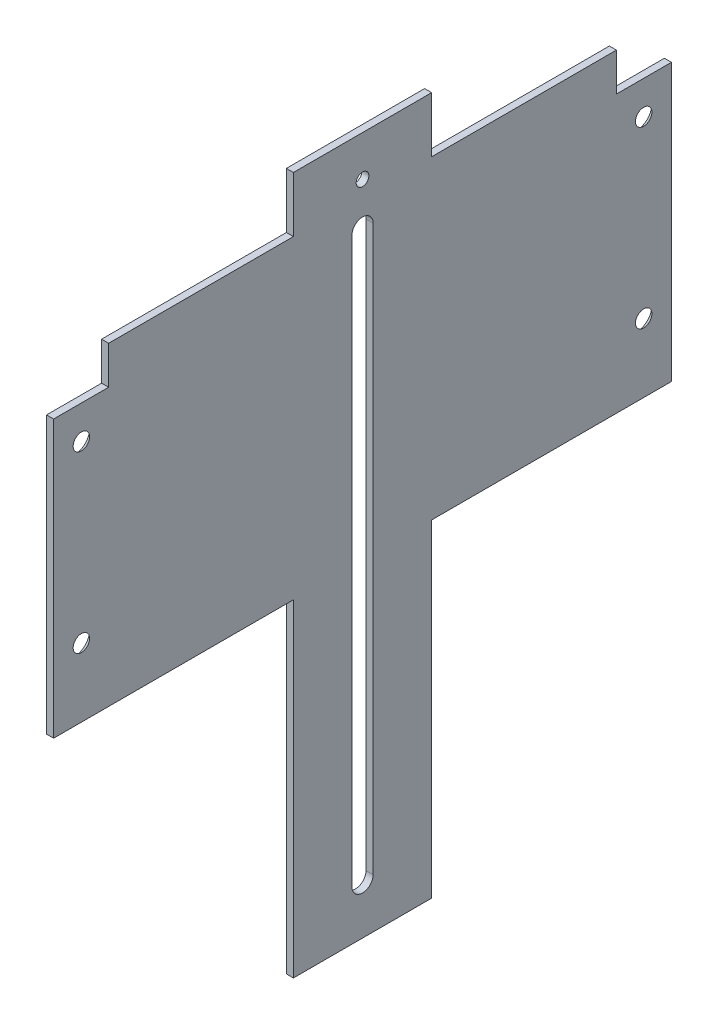
ISO-10303-21;
HEADER;
FILE_DESCRIPTION(('STEP AP214'),'2;1');
FILE_NAME('part.step','',(''),(''),'','','');
FILE_SCHEMA(('AUTOMOTIVE_DESIGN { 1 0 10303 214 1 1 1 1 }'));
ENDSEC;
DATA;
#1=APPLICATION_CONTEXT('core data for automotive mechanical design processes');
#2=APPLICATION_PROTOCOL_DEFINITION('international standard','automotive_design',2000,#1);
#3=PRODUCT_CONTEXT('',#1,'mechanical');
#4=PRODUCT('Part','Part','',(#3));
#5=PRODUCT_RELATED_PRODUCT_CATEGORY('part','',(#4));
#6=PRODUCT_DEFINITION_FORMATION('','',#4);
#7=PRODUCT_DEFINITION_CONTEXT('part definition',#1,'design');
#8=PRODUCT_DEFINITION('design','',#6,#7);
#9=PRODUCT_DEFINITION_SHAPE('','',#8);
#10=(LENGTH_UNIT() NAMED_UNIT(*) SI_UNIT(.MILLI.,.METRE.));
#11=(NAMED_UNIT(*) PLANE_ANGLE_UNIT() SI_UNIT($,.RADIAN.));
#12=(NAMED_UNIT(*) SI_UNIT($,.STERADIAN.) SOLID_ANGLE_UNIT());
#13=UNCERTAINTY_MEASURE_WITH_UNIT(LENGTH_MEASURE(1.E-05),#10,'distance_accuracy_value','');
#14=(GEOMETRIC_REPRESENTATION_CONTEXT(3) GLOBAL_UNCERTAINTY_ASSIGNED_CONTEXT((#13)) GLOBAL_UNIT_ASSIGNED_CONTEXT((#10,
#11,#12)) REPRESENTATION_CONTEXT('',''));
#15=CARTESIAN_POINT('',(0.,0.,0.));
#16=DIRECTION('',(0.,0.,1.));
#17=DIRECTION('',(1.,0.,0.));
#18=AXIS2_PLACEMENT_3D('',#15,#16,#17);
#19=CARTESIAN_POINT('',(0.,0.,0.));
#20=DIRECTION('',(1.,0.,0.));
#21=DIRECTION('',(0.,0.,-1.));
#22=AXIS2_PLACEMENT_3D('',#19,#20,#21);
#23=PLANE('',#22);
#24=CARTESIAN_POINT('',(0.,-52.5909473684211,-31.3460500310203));
#25=DIRECTION('',(-1.,0.,0.));
#26=DIRECTION('',(0.,0.,1.));
#27=AXIS2_PLACEMENT_3D('',#24,#25,#26);
#28=CIRCLE('',#27,2.75);
#29=CARTESIAN_POINT('',(0.,-52.5909473684211,-28.5960500310203));
#30=VERTEX_POINT('',#29);
#31=EDGE_CURVE('E386',#30,#30,#28,.T.);
#32=ORIENTED_EDGE('',*,*,#31,.F.);
#33=EDGE_LOOP('',(#32));
#34=FACE_BOUND('',#33,.T.);
#35=CARTESIAN_POINT('',(0.,-21.1486455373109,69.9059499689797));
#36=DIRECTION('',(-1.,0.,0.));
#37=DIRECTION('',(0.,0.,1.));
#38=AXIS2_PLACEMENT_3D('',#35,#36,#37);
#39=CIRCLE('',#38,2.75);
#40=CARTESIAN_POINT('',(0.,-21.1486455373109,72.6559499689797));
#41=VERTEX_POINT('',#40);
#42=EDGE_CURVE('E380',#41,#41,#39,.T.);
#43=ORIENTED_EDGE('',*,*,#42,.F.);
#44=EDGE_LOOP('',(#43));
#45=FACE_BOUND('',#44,.T.);
#46=CARTESIAN_POINT('',(0.,-5.59189553731093,19.2799499689797));
#47=DIRECTION('',(-1.,0.,0.));
#48=DIRECTION('',(0.,0.,1.));
#49=AXIS2_PLACEMENT_3D('',#46,#47,#48);
#50=CIRCLE('',#49,1.143);
#51=CARTESIAN_POINT('',(0.,-5.59189553731093,20.4229499689797));
#52=VERTEX_POINT('',#51);
#53=EDGE_CURVE('E368',#52,#52,#50,.T.);
#54=ORIENTED_EDGE('',*,*,#53,.F.);
#55=EDGE_LOOP('',(#54));
#56=FACE_BOUND('',#55,.T.);
#57=DIRECTION('',(0.,-1.,0.));
#58=VECTOR('',#57,1.);
#59=CARTESIAN_POINT('',(0.,-13.3706455373109,17.3749499689797));
#60=LINE('',#59,#58);
#61=CARTESIAN_POINT('',(0.,-13.3706455373109,17.3749499689797));
#62=VERTEX_POINT('',#61);
#63=CARTESIAN_POINT('',(0.,-114.970645537311,17.3749499689797));
#64=VERTEX_POINT('',#63);
#65=EDGE_CURVE('E159',#62,#64,#60,.T.);
#66=ORIENTED_EDGE('',*,*,#65,.F.);
#67=CARTESIAN_POINT('',(0.,-13.3706455373109,19.2799499689797));
#68=DIRECTION('',(-1.,0.,0.));
#69=DIRECTION('',(0.,0.,1.));
#70=AXIS2_PLACEMENT_3D('',#67,#68,#69);
#71=CIRCLE('',#70,1.905);
#72=CARTESIAN_POINT('',(0.,-13.3706455373109,21.1849499689797));
#73=VERTEX_POINT('',#72);
#74=EDGE_CURVE('E364',#73,#62,#71,.T.);
#75=ORIENTED_EDGE('',*,*,#74,.F.);
#76=DIRECTION('',(0.,1.,0.));
#77=VECTOR('',#76,1.);
#78=CARTESIAN_POINT('',(0.,-13.3706455373109,21.1849499689797));
#79=LINE('',#78,#77);
#80=CARTESIAN_POINT('',(0.,-114.970645537311,21.1849499689797));
#81=VERTEX_POINT('',#80);
#82=EDGE_CURVE('E359',#81,#73,#79,.T.);
#83=ORIENTED_EDGE('',*,*,#82,.F.);
#84=CARTESIAN_POINT('',(0.,-114.970645537311,19.2799499689797));
#85=DIRECTION('',(-1.,0.,0.));
#86=DIRECTION('',(0.,0.,1.));
#87=AXIS2_PLACEMENT_3D('',#84,#85,#86);
#88=CIRCLE('',#87,1.90499999999999);
#89=EDGE_CURVE('E319',#64,#81,#88,.T.);
#90=ORIENTED_EDGE('',*,*,#89,.F.);
#91=EDGE_LOOP('',(#66,#75,#83,#90));
#92=FACE_BOUND('',#91,.T.);
#93=DIRECTION('',(0.,0.,1.));
#94=VECTOR('',#93,1.);
#95=CARTESIAN_POINT('',(0.,-8.29064553731093,-36.3460500310203));
#96=LINE('',#95,#94);
#97=CARTESIAN_POINT('',(0.,-8.29064553731093,-26.4400500310203));
#98=VERTEX_POINT('',#97);
#99=CARTESIAN_POINT('',(0.,-8.29064553731093,6.83394996897969));
#100=VERTEX_POINT('',#99);
#101=EDGE_CURVE('E357',#98,#100,#96,.T.);
#102=ORIENTED_EDGE('',*,*,#101,.F.);
#103=DIRECTION('',(0.,1.,0.));
#104=VECTOR('',#103,1.);
#105=CARTESIAN_POINT('',(0.,-8.29064553731093,-26.4400500310203));
#106=LINE('',#105,#104);
#107=CARTESIAN_POINT('',(0.,-15.1486455373109,-26.4400500310203));
#108=VERTEX_POINT('',#107);
#109=EDGE_CURVE('E134',#108,#98,#106,.T.);
#110=ORIENTED_EDGE('',*,*,#109,.F.);
#111=DIRECTION('',(0.,0.,1.));
#112=VECTOR('',#111,1.);
#113=CARTESIAN_POINT('',(0.,-15.1486455373109,-36.3460500310203));
#114=LINE('',#113,#112);
#115=CARTESIAN_POINT('',(0.,-15.1486455373109,-36.3460500310203));
#116=VERTEX_POINT('',#115);
#117=EDGE_CURVE('E249',#116,#108,#114,.T.);
#118=ORIENTED_EDGE('',*,*,#117,.F.);
#119=DIRECTION('',(0.,1.,0.));
#120=VECTOR('',#119,1.);
#121=CARTESIAN_POINT('',(0.,-8.29064553731093,-36.3460500310203));
#122=LINE('',#121,#120);
#123=CARTESIAN_POINT('',(0.,-64.9326455373109,-36.3460500310203));
#124=VERTEX_POINT('',#123);
#125=EDGE_CURVE('E259',#124,#116,#122,.T.);
#126=ORIENTED_EDGE('',*,*,#125,.F.);
#127=DIRECTION('',(0.,0.,-1.));
#128=VECTOR('',#127,1.);
#129=CARTESIAN_POINT('',(0.,-64.9326455373109,-36.3460500310203));
#130=LINE('',#129,#128);
#131=CARTESIAN_POINT('',(0.,-64.9326455373109,6.83394996897969));
#132=VERTEX_POINT('',#131);
#133=EDGE_CURVE('E263',#132,#124,#130,.T.);
#134=ORIENTED_EDGE('',*,*,#133,.F.);
#135=DIRECTION('',(0.,1.,0.));
#136=VECTOR('',#135,1.);
#137=CARTESIAN_POINT('',(0.,-64.9326455373109,6.83394996897969));
#138=LINE('',#137,#136);
#139=CARTESIAN_POINT('',(0.,-123.911447322897,6.83394996897969));
#140=VERTEX_POINT('',#139);
#141=EDGE_CURVE('E265',#140,#132,#138,.T.);
#142=ORIENTED_EDGE('',*,*,#141,.F.);
#143=DIRECTION('',(0.,0.,-1.));
#144=VECTOR('',#143,1.);
#145=CARTESIAN_POINT('',(0.,-123.911447322897,6.83394996897969));
#146=LINE('',#145,#144);
#147=CARTESIAN_POINT('',(0.,-123.911447322897,31.7259499689797));
#148=VERTEX_POINT('',#147);
#149=EDGE_CURVE('E271',#148,#140,#146,.T.);
#150=ORIENTED_EDGE('',*,*,#149,.F.);
#151=DIRECTION('',(0.,-1.,0.));
#152=VECTOR('',#151,1.);
#153=CARTESIAN_POINT('',(0.,-123.911447322897,31.7259499689797));
#154=LINE('',#153,#152);
#155=CARTESIAN_POINT('',(0.,-64.9326455373109,31.7259499689797));
#156=VERTEX_POINT('',#155);
#157=EDGE_CURVE('E274',#156,#148,#154,.T.);
#158=ORIENTED_EDGE('',*,*,#157,.F.);
#159=DIRECTION('',(0.,0.,-1.));
#160=VECTOR('',#159,1.);
#161=CARTESIAN_POINT('',(0.,-64.9326455373109,31.7259499689797));
#162=LINE('',#161,#160);
#163=CARTESIAN_POINT('',(0.,-64.9326455373109,74.9059499689797));
#164=VERTEX_POINT('',#163);
#165=EDGE_CURVE('E277',#164,#156,#162,.T.);
#166=ORIENTED_EDGE('',*,*,#165,.F.);
#167=DIRECTION('',(0.,-1.,0.));
#168=VECTOR('',#167,1.);
#169=CARTESIAN_POINT('',(0.,-8.29064553731093,74.9059499689797));
#170=LINE('',#169,#168);
#171=CARTESIAN_POINT('',(0.,-15.1486455373109,74.9059499689797));
#172=VERTEX_POINT('',#171);
#173=EDGE_CURVE('E280',#172,#164,#170,.T.);
#174=ORIENTED_EDGE('',*,*,#173,.F.);
#175=DIRECTION('',(0.,0.,1.));
#176=VECTOR('',#175,1.);
#177=CARTESIAN_POINT('',(0.,-15.1486455373109,74.9059499689797));
#178=LINE('',#177,#176);
#179=CARTESIAN_POINT('',(0.,-15.1486455373109,64.9999499689797));
#180=VERTEX_POINT('',#179);
#181=EDGE_CURVE('E283',#180,#172,#178,.T.);
#182=ORIENTED_EDGE('',*,*,#181,.F.);
#183=DIRECTION('',(0.,-1.,0.));
#184=VECTOR('',#183,1.);
#185=CARTESIAN_POINT('',(0.,-8.29064553731092,64.9999499689797));
#186=LINE('',#185,#184);
#187=CARTESIAN_POINT('',(0.,-8.29064553731093,64.9999499689797));
#188=VERTEX_POINT('',#187);
#189=EDGE_CURVE('E286',#188,#180,#186,.T.);
#190=ORIENTED_EDGE('',*,*,#189,.F.);
#191=DIRECTION('',(0.,0.,1.));
#192=VECTOR('',#191,1.);
#193=CARTESIAN_POINT('',(0.,-8.29064553731092,31.7259499689797));
#194=LINE('',#193,#192);
#195=CARTESIAN_POINT('',(0.,-8.29064553731092,31.7259499689797));
#196=VERTEX_POINT('',#195);
#197=EDGE_CURVE('E289',#196,#188,#194,.T.);
#198=ORIENTED_EDGE('',*,*,#197,.F.);
#199=DIRECTION('',(0.,-1.,0.));
#200=VECTOR('',#199,1.);
#201=CARTESIAN_POINT('',(0.,1.70935446268907,31.7259499689797));
#202=LINE('',#201,#200);
#203=CARTESIAN_POINT('',(0.,1.70935446268907,31.7259499689797));
#204=VERTEX_POINT('',#203);
#205=EDGE_CURVE('E292',#204,#196,#202,.T.);
#206=ORIENTED_EDGE('',*,*,#205,.F.);
#207=DIRECTION('',(0.,0.,1.));
#208=VECTOR('',#207,1.);
#209=CARTESIAN_POINT('',(0.,1.70935446268908,6.83394996897969));
#210=LINE('',#209,#208);
#211=CARTESIAN_POINT('',(0.,1.70935446268908,6.83394996897969));
#212=VERTEX_POINT('',#211);
#213=EDGE_CURVE('E295',#212,#204,#210,.T.);
#214=ORIENTED_EDGE('',*,*,#213,.F.);
#215=DIRECTION('',(0.,1.,0.));
#216=VECTOR('',#215,1.);
#217=CARTESIAN_POINT('',(0.,-8.29064553731093,6.83394996897969));
#218=LINE('',#217,#216);
#219=EDGE_CURVE('E207',#100,#212,#218,.T.);
#220=ORIENTED_EDGE('',*,*,#219,.F.);
#221=EDGE_LOOP('',(#102,#110,#118,#126,#134,#142,#150,#158,#166,#174,#182,#190,#198,#206,#214,#220));
#222=FACE_BOUND('',#221,.T.);
#223=CARTESIAN_POINT('',(0.,-52.5909473684211,69.9059499689797));
#224=DIRECTION('',(-1.,0.,0.));
#225=DIRECTION('',(0.,0.,1.));
#226=AXIS2_PLACEMENT_3D('',#223,#224,#225);
#227=CIRCLE('',#226,2.75);
#228=CARTESIAN_POINT('',(0.,-52.5909473684211,72.6559499689797));
#229=VERTEX_POINT('',#228);
#230=EDGE_CURVE('E374',#229,#229,#227,.T.);
#231=ORIENTED_EDGE('',*,*,#230,.F.);
#232=EDGE_LOOP('',(#231));
#233=FACE_BOUND('',#232,.T.);
#234=CARTESIAN_POINT('',(0.,-21.1486455373109,-31.3460500310203));
#235=DIRECTION('',(-1.,0.,0.));
#236=DIRECTION('',(0.,0.,1.));
#237=AXIS2_PLACEMENT_3D('',#234,#235,#236);
#238=CIRCLE('',#237,2.75);
#239=CARTESIAN_POINT('',(0.,-21.1486455373109,-28.5960500310203));
#240=VERTEX_POINT('',#239);
#241=EDGE_CURVE('E392',#240,#240,#238,.T.);
#242=ORIENTED_EDGE('',*,*,#241,.F.);
#243=EDGE_LOOP('',(#242));
#244=FACE_BOUND('',#243,.T.);
#245=ADVANCED_FACE('F39',(#34,#45,#56,#92,#222,#233,#244),#23,.F.);
#246=CARTESIAN_POINT('',(0.,-15.1486455373109,-36.3460500310203));
#247=DIRECTION('',(0.,1.,0.));
#248=DIRECTION('',(0.,0.,1.));
#249=AXIS2_PLACEMENT_3D('',#246,#247,#248);
#250=PLANE('',#249);
#251=DIRECTION('',(-1.,0.,0.));
#252=VECTOR('',#251,1.);
#253=CARTESIAN_POINT('',(0.,-15.1486455373109,-26.4400500310203));
#254=LINE('',#253,#252);
#255=CARTESIAN_POINT('',(1.27,-15.1486455373109,-26.4400500310203));
#256=VERTEX_POINT('',#255);
#257=EDGE_CURVE('E11',#256,#108,#254,.T.);
#258=ORIENTED_EDGE('',*,*,#257,.F.);
#259=DIRECTION('',(0.,0.,-1.));
#260=VECTOR('',#259,1.);
#261=CARTESIAN_POINT('',(1.27,-15.1486455373109,0.));
#262=LINE('',#261,#260);
#263=CARTESIAN_POINT('',(1.27,-15.1486455373109,-36.3460500310203));
#264=VERTEX_POINT('',#263);
#265=EDGE_CURVE('E145',#264,#256,#262,.F.);
#266=ORIENTED_EDGE('',*,*,#265,.F.);
#267=DIRECTION('',(-1.,0.,0.));
#268=VECTOR('',#267,1.);
#269=CARTESIAN_POINT('',(0.,-15.1486455373109,-36.3460500310203));
#270=LINE('',#269,#268);
#271=EDGE_CURVE('E49',#264,#116,#270,.T.);
#272=ORIENTED_EDGE('',*,*,#271,.T.);
#273=ORIENTED_EDGE('',*,*,#117,.T.);
#274=EDGE_LOOP('',(#258,#266,#272,#273));
#275=FACE_BOUND('',#274,.T.);
#276=ADVANCED_FACE('F247',(#275),#250,.T.);
#277=CARTESIAN_POINT('',(0.,-8.29064553731093,-36.3460500310203));
#278=DIRECTION('',(0.,0.,-1.));
#279=DIRECTION('',(0.,1.,0.));
#280=AXIS2_PLACEMENT_3D('',#277,#278,#279);
#281=PLANE('',#280);
#282=ORIENTED_EDGE('',*,*,#271,.F.);
#283=DIRECTION('',(0.,1.,0.));
#284=VECTOR('',#283,1.);
#285=CARTESIAN_POINT('',(1.27,0.,-36.3460500310203));
#286=LINE('',#285,#284);
#287=CARTESIAN_POINT('',(1.27,-64.9326455373109,-36.3460500310203));
#288=VERTEX_POINT('',#287);
#289=EDGE_CURVE('E193',#288,#264,#286,.T.);
#290=ORIENTED_EDGE('',*,*,#289,.F.);
#291=DIRECTION('',(-1.,0.,0.));
#292=VECTOR('',#291,1.);
#293=CARTESIAN_POINT('',(0.,-64.9326455373109,-36.3460500310203));
#294=LINE('',#293,#292);
#295=EDGE_CURVE('E241',#288,#124,#294,.T.);
#296=ORIENTED_EDGE('',*,*,#295,.T.);
#297=ORIENTED_EDGE('',*,*,#125,.T.);
#298=EDGE_LOOP('',(#282,#290,#296,#297));
#299=FACE_BOUND('',#298,.T.);
#300=ADVANCED_FACE('F262',(#299),#281,.T.);
#301=CARTESIAN_POINT('',(0.,-64.9326455373109,-36.3460500310203));
#302=DIRECTION('',(0.,-1.,0.));
#303=DIRECTION('',(0.,0.,-1.));
#304=AXIS2_PLACEMENT_3D('',#301,#302,#303);
#305=PLANE('',#304);
#306=ORIENTED_EDGE('',*,*,#295,.F.);
#307=DIRECTION('',(0.,0.,-1.));
#308=VECTOR('',#307,1.);
#309=CARTESIAN_POINT('',(1.27,-64.9326455373109,0.));
#310=LINE('',#309,#308);
#311=CARTESIAN_POINT('',(1.27,-64.9326455373109,6.83394996897969));
#312=VERTEX_POINT('',#311);
#313=EDGE_CURVE('E190',#312,#288,#310,.T.);
#314=ORIENTED_EDGE('',*,*,#313,.F.);
#315=DIRECTION('',(-1.,0.,0.));
#316=VECTOR('',#315,1.);
#317=CARTESIAN_POINT('',(0.,-64.9326455373109,6.83394996897969));
#318=LINE('',#317,#316);
#319=EDGE_CURVE('E238',#312,#132,#318,.T.);
#320=ORIENTED_EDGE('',*,*,#319,.T.);
#321=ORIENTED_EDGE('',*,*,#133,.T.);
#322=EDGE_LOOP('',(#306,#314,#320,#321));
#323=FACE_BOUND('',#322,.T.);
#324=ADVANCED_FACE('F464',(#323),#305,.T.);
#325=CARTESIAN_POINT('',(0.,-64.9326455373109,6.83394996897969));
#326=DIRECTION('',(0.,0.,-1.));
#327=DIRECTION('',(0.,1.,0.));
#328=AXIS2_PLACEMENT_3D('',#325,#326,#327);
#329=PLANE('',#328);
#330=ORIENTED_EDGE('',*,*,#319,.F.);
#331=DIRECTION('',(0.,1.,0.));
#332=VECTOR('',#331,1.);
#333=CARTESIAN_POINT('',(1.27,0.,6.83394996897969));
#334=LINE('',#333,#332);
#335=CARTESIAN_POINT('',(1.27,-123.911447322897,6.83394996897969));
#336=VERTEX_POINT('',#335);
#337=EDGE_CURVE('E187',#336,#312,#334,.T.);
#338=ORIENTED_EDGE('',*,*,#337,.F.);
#339=DIRECTION('',(-1.,0.,0.));
#340=VECTOR('',#339,1.);
#341=CARTESIAN_POINT('',(0.,-123.911447322897,6.83394996897969));
#342=LINE('',#341,#340);
#343=EDGE_CURVE('E235',#336,#140,#342,.T.);
#344=ORIENTED_EDGE('',*,*,#343,.T.);
#345=ORIENTED_EDGE('',*,*,#141,.T.);
#346=EDGE_LOOP('',(#330,#338,#344,#345));
#347=FACE_BOUND('',#346,.T.);
#348=ADVANCED_FACE('F460',(#347),#329,.T.);
#349=CARTESIAN_POINT('',(0.,-123.911447322897,6.83394996897969));
#350=DIRECTION('',(0.,-1.,0.));
#351=DIRECTION('',(0.,0.,-1.));
#352=AXIS2_PLACEMENT_3D('',#349,#350,#351);
#353=PLANE('',#352);
#354=ORIENTED_EDGE('',*,*,#343,.F.);
#355=DIRECTION('',(0.,0.,-1.));
#356=VECTOR('',#355,1.);
#357=CARTESIAN_POINT('',(1.27,-123.911447322897,0.));
#358=LINE('',#357,#356);
#359=CARTESIAN_POINT('',(1.27,-123.911447322897,31.7259499689797));
#360=VERTEX_POINT('',#359);
#361=EDGE_CURVE('E184',#360,#336,#358,.T.);
#362=ORIENTED_EDGE('',*,*,#361,.F.);
#363=DIRECTION('',(-1.,0.,0.));
#364=VECTOR('',#363,1.);
#365=CARTESIAN_POINT('',(0.,-123.911447322897,31.7259499689797));
#366=LINE('',#365,#364);
#367=EDGE_CURVE('E232',#360,#148,#366,.T.);
#368=ORIENTED_EDGE('',*,*,#367,.T.);
#369=ORIENTED_EDGE('',*,*,#149,.T.);
#370=EDGE_LOOP('',(#354,#362,#368,#369));
#371=FACE_BOUND('',#370,.T.);
#372=ADVANCED_FACE('F456',(#371),#353,.T.);
#373=CARTESIAN_POINT('',(0.,-123.911447322897,31.7259499689797));
#374=DIRECTION('',(0.,0.,1.));
#375=DIRECTION('',(0.,-1.,0.));
#376=AXIS2_PLACEMENT_3D('',#373,#374,#375);
#377=PLANE('',#376);
#378=ORIENTED_EDGE('',*,*,#367,.F.);
#379=DIRECTION('',(0.,1.,0.));
#380=VECTOR('',#379,1.);
#381=CARTESIAN_POINT('',(1.27,0.,31.7259499689797));
#382=LINE('',#381,#380);
#383=CARTESIAN_POINT('',(1.27,-64.9326455373109,31.7259499689797));
#384=VERTEX_POINT('',#383);
#385=EDGE_CURVE('E181',#384,#360,#382,.F.);
#386=ORIENTED_EDGE('',*,*,#385,.F.);
#387=DIRECTION('',(-1.,0.,0.));
#388=VECTOR('',#387,1.);
#389=CARTESIAN_POINT('',(0.,-64.9326455373109,31.7259499689797));
#390=LINE('',#389,#388);
#391=EDGE_CURVE('E229',#384,#156,#390,.T.);
#392=ORIENTED_EDGE('',*,*,#391,.T.);
#393=ORIENTED_EDGE('',*,*,#157,.T.);
#394=EDGE_LOOP('',(#378,#386,#392,#393));
#395=FACE_BOUND('',#394,.T.);
#396=ADVANCED_FACE('F452',(#395),#377,.T.);
#397=CARTESIAN_POINT('',(0.,-64.9326455373109,31.7259499689797));
#398=DIRECTION('',(0.,-1.,0.));
#399=DIRECTION('',(0.,0.,-1.));
#400=AXIS2_PLACEMENT_3D('',#397,#398,#399);
#401=PLANE('',#400);
#402=ORIENTED_EDGE('',*,*,#391,.F.);
#403=DIRECTION('',(0.,0.,-1.));
#404=VECTOR('',#403,1.);
#405=CARTESIAN_POINT('',(1.27,-64.9326455373109,0.));
#406=LINE('',#405,#404);
#407=CARTESIAN_POINT('',(1.27,-64.9326455373109,74.9059499689797));
#408=VERTEX_POINT('',#407);
#409=EDGE_CURVE('E178',#408,#384,#406,.T.);
#410=ORIENTED_EDGE('',*,*,#409,.F.);
#411=DIRECTION('',(-1.,0.,0.));
#412=VECTOR('',#411,1.);
#413=CARTESIAN_POINT('',(0.,-64.9326455373109,74.9059499689797));
#414=LINE('',#413,#412);
#415=EDGE_CURVE('E226',#408,#164,#414,.T.);
#416=ORIENTED_EDGE('',*,*,#415,.T.);
#417=ORIENTED_EDGE('',*,*,#165,.T.);
#418=EDGE_LOOP('',(#402,#410,#416,#417));
#419=FACE_BOUND('',#418,.T.);
#420=ADVANCED_FACE('F448',(#419),#401,.T.);
#421=CARTESIAN_POINT('',(0.,-8.29064553731093,74.9059499689797));
#422=DIRECTION('',(0.,0.,1.));
#423=DIRECTION('',(0.,-1.,0.));
#424=AXIS2_PLACEMENT_3D('',#421,#422,#423);
#425=PLANE('',#424);
#426=ORIENTED_EDGE('',*,*,#415,.F.);
#427=DIRECTION('',(0.,1.,0.));
#428=VECTOR('',#427,1.);
#429=CARTESIAN_POINT('',(1.27,0.,74.9059499689797));
#430=LINE('',#429,#428);
#431=CARTESIAN_POINT('',(1.27,-15.1486455373109,74.9059499689797));
#432=VERTEX_POINT('',#431);
#433=EDGE_CURVE('E175',#432,#408,#430,.F.);
#434=ORIENTED_EDGE('',*,*,#433,.F.);
#435=DIRECTION('',(-1.,0.,0.));
#436=VECTOR('',#435,1.);
#437=CARTESIAN_POINT('',(0.,-15.1486455373109,74.9059499689797));
#438=LINE('',#437,#436);
#439=EDGE_CURVE('E223',#432,#172,#438,.T.);
#440=ORIENTED_EDGE('',*,*,#439,.T.);
#441=ORIENTED_EDGE('',*,*,#173,.T.);
#442=EDGE_LOOP('',(#426,#434,#440,#441));
#443=FACE_BOUND('',#442,.T.);
#444=ADVANCED_FACE('F444',(#443),#425,.T.);
#445=CARTESIAN_POINT('',(0.,-15.1486455373109,74.9059499689797));
#446=DIRECTION('',(0.,1.,0.));
#447=DIRECTION('',(0.,0.,1.));
#448=AXIS2_PLACEMENT_3D('',#445,#446,#447);
#449=PLANE('',#448);
#450=ORIENTED_EDGE('',*,*,#439,.F.);
#451=DIRECTION('',(0.,0.,-1.));
#452=VECTOR('',#451,1.);
#453=CARTESIAN_POINT('',(1.27,-15.1486455373109,0.));
#454=LINE('',#453,#452);
#455=CARTESIAN_POINT('',(1.27,-15.1486455373109,64.9999499689797));
#456=VERTEX_POINT('',#455);
#457=EDGE_CURVE('E172',#456,#432,#454,.F.);
#458=ORIENTED_EDGE('',*,*,#457,.F.);
#459=DIRECTION('',(-1.,0.,0.));
#460=VECTOR('',#459,1.);
#461=CARTESIAN_POINT('',(0.,-15.1486455373109,64.9999499689797));
#462=LINE('',#461,#460);
#463=EDGE_CURVE('E220',#456,#180,#462,.T.);
#464=ORIENTED_EDGE('',*,*,#463,.T.);
#465=ORIENTED_EDGE('',*,*,#181,.T.);
#466=EDGE_LOOP('',(#450,#458,#464,#465));
#467=FACE_BOUND('',#466,.T.);
#468=ADVANCED_FACE('F440',(#467),#449,.T.);
#469=CARTESIAN_POINT('',(0.,-8.29064553731092,64.9999499689797));
#470=DIRECTION('',(0.,0.,1.));
#471=DIRECTION('',(0.,-1.,0.));
#472=AXIS2_PLACEMENT_3D('',#469,#470,#471);
#473=PLANE('',#472);
#474=ORIENTED_EDGE('',*,*,#463,.F.);
#475=DIRECTION('',(0.,1.,0.));
#476=VECTOR('',#475,1.);
#477=CARTESIAN_POINT('',(1.27,0.,64.9999499689797));
#478=LINE('',#477,#476);
#479=CARTESIAN_POINT('',(1.27,-8.29064553731093,64.9999499689797));
#480=VERTEX_POINT('',#479);
#481=EDGE_CURVE('E169',#480,#456,#478,.F.);
#482=ORIENTED_EDGE('',*,*,#481,.F.);
#483=DIRECTION('',(-1.,0.,0.));
#484=VECTOR('',#483,1.);
#485=CARTESIAN_POINT('',(0.,-8.29064553731093,64.9999499689797));
#486=LINE('',#485,#484);
#487=EDGE_CURVE('E217',#480,#188,#486,.T.);
#488=ORIENTED_EDGE('',*,*,#487,.T.);
#489=ORIENTED_EDGE('',*,*,#189,.T.);
#490=EDGE_LOOP('',(#474,#482,#488,#489));
#491=FACE_BOUND('',#490,.T.);
#492=ADVANCED_FACE('F436',(#491),#473,.T.);
#493=CARTESIAN_POINT('',(0.,-8.29064553731092,31.7259499689797));
#494=DIRECTION('',(0.,1.,0.));
#495=DIRECTION('',(0.,0.,1.));
#496=AXIS2_PLACEMENT_3D('',#493,#494,#495);
#497=PLANE('',#496);
#498=ORIENTED_EDGE('',*,*,#487,.F.);
#499=DIRECTION('',(0.,0.,-1.));
#500=VECTOR('',#499,1.);
#501=CARTESIAN_POINT('',(1.27,-8.29064553731092,0.));
#502=LINE('',#501,#500);
#503=CARTESIAN_POINT('',(1.27,-8.29064553731092,31.7259499689797));
#504=VERTEX_POINT('',#503);
#505=EDGE_CURVE('E166',#504,#480,#502,.F.);
#506=ORIENTED_EDGE('',*,*,#505,.F.);
#507=DIRECTION('',(-1.,0.,0.));
#508=VECTOR('',#507,1.);
#509=CARTESIAN_POINT('',(0.,-8.29064553731092,31.7259499689797));
#510=LINE('',#509,#508);
#511=EDGE_CURVE('E214',#504,#196,#510,.T.);
#512=ORIENTED_EDGE('',*,*,#511,.T.);
#513=ORIENTED_EDGE('',*,*,#197,.T.);
#514=EDGE_LOOP('',(#498,#506,#512,#513));
#515=FACE_BOUND('',#514,.T.);
#516=ADVANCED_FACE('F433',(#515),#497,.T.);
#517=CARTESIAN_POINT('',(0.,1.70935446268907,31.7259499689797));
#518=DIRECTION('',(0.,0.,1.));
#519=DIRECTION('',(0.,-1.,0.));
#520=AXIS2_PLACEMENT_3D('',#517,#518,#519);
#521=PLANE('',#520);
#522=ORIENTED_EDGE('',*,*,#511,.F.);
#523=DIRECTION('',(0.,1.,0.));
#524=VECTOR('',#523,1.);
#525=CARTESIAN_POINT('',(1.27,0.,31.7259499689797));
#526=LINE('',#525,#524);
#527=CARTESIAN_POINT('',(1.27,1.70935446268907,31.7259499689797));
#528=VERTEX_POINT('',#527);
#529=EDGE_CURVE('E163',#528,#504,#526,.F.);
#530=ORIENTED_EDGE('',*,*,#529,.F.);
#531=DIRECTION('',(-1.,0.,0.));
#532=VECTOR('',#531,1.);
#533=CARTESIAN_POINT('',(0.,1.70935446268907,31.7259499689797));
#534=LINE('',#533,#532);
#535=EDGE_CURVE('E211',#528,#204,#534,.T.);
#536=ORIENTED_EDGE('',*,*,#535,.T.);
#537=ORIENTED_EDGE('',*,*,#205,.T.);
#538=EDGE_LOOP('',(#522,#530,#536,#537));
#539=FACE_BOUND('',#538,.T.);
#540=ADVANCED_FACE('F348',(#539),#521,.T.);
#541=CARTESIAN_POINT('',(0.,1.70935446268908,6.83394996897969));
#542=DIRECTION('',(0.,1.,0.));
#543=DIRECTION('',(0.,0.,1.));
#544=AXIS2_PLACEMENT_3D('',#541,#542,#543);
#545=PLANE('',#544);
#546=ORIENTED_EDGE('',*,*,#535,.F.);
#547=DIRECTION('',(0.,0.,-1.));
#548=VECTOR('',#547,1.);
#549=CARTESIAN_POINT('',(1.27,1.70935446268908,0.));
#550=LINE('',#549,#548);
#551=CARTESIAN_POINT('',(1.27,1.70935446268908,6.83394996897969));
#552=VERTEX_POINT('',#551);
#553=EDGE_CURVE('E160',#552,#528,#550,.F.);
#554=ORIENTED_EDGE('',*,*,#553,.F.);
#555=DIRECTION('',(-1.,0.,0.));
#556=VECTOR('',#555,1.);
#557=CARTESIAN_POINT('',(0.,1.70935446268908,6.83394996897969));
#558=LINE('',#557,#556);
#559=EDGE_CURVE('E209',#552,#212,#558,.T.);
#560=ORIENTED_EDGE('',*,*,#559,.T.);
#561=ORIENTED_EDGE('',*,*,#213,.T.);
#562=EDGE_LOOP('',(#546,#554,#560,#561));
#563=FACE_BOUND('',#562,.T.);
#564=ADVANCED_FACE('F355',(#563),#545,.T.);
#565=CARTESIAN_POINT('',(0.,-8.29064553731093,6.83394996897969));
#566=DIRECTION('',(0.,0.,-1.));
#567=DIRECTION('',(0.,1.,0.));
#568=AXIS2_PLACEMENT_3D('',#565,#566,#567);
#569=PLANE('',#568);
#570=ORIENTED_EDGE('',*,*,#559,.F.);
#571=DIRECTION('',(0.,1.,0.));
#572=VECTOR('',#571,1.);
#573=CARTESIAN_POINT('',(1.27,0.,6.83394996897969));
#574=LINE('',#573,#572);
#575=CARTESIAN_POINT('',(1.27,-8.29064553731093,6.83394996897969));
#576=VERTEX_POINT('',#575);
#577=EDGE_CURVE('E157',#576,#552,#574,.T.);
#578=ORIENTED_EDGE('',*,*,#577,.F.);
#579=DIRECTION('',(-1.,0.,0.));
#580=VECTOR('',#579,1.);
#581=CARTESIAN_POINT('',(0.,-8.29064553731093,6.83394996897969));
#582=LINE('',#581,#580);
#583=EDGE_CURVE('E58',#576,#100,#582,.T.);
#584=ORIENTED_EDGE('',*,*,#583,.T.);
#585=ORIENTED_EDGE('',*,*,#219,.T.);
#586=EDGE_LOOP('',(#570,#578,#584,#585));
#587=FACE_BOUND('',#586,.T.);
#588=ADVANCED_FACE('F356',(#587),#569,.T.);
#589=CARTESIAN_POINT('',(0.,-8.29064553731093,-36.3460500310203));
#590=DIRECTION('',(0.,1.,0.));
#591=DIRECTION('',(0.,0.,1.));
#592=AXIS2_PLACEMENT_3D('',#589,#590,#591);
#593=PLANE('',#592);
#594=ORIENTED_EDGE('',*,*,#583,.F.);
#595=DIRECTION('',(0.,0.,-1.));
#596=VECTOR('',#595,1.);
#597=CARTESIAN_POINT('',(1.27,-8.29064553731093,0.));
#598=LINE('',#597,#596);
#599=CARTESIAN_POINT('',(1.27,-8.29064553731093,-26.4400500310203));
#600=VERTEX_POINT('',#599);
#601=EDGE_CURVE('E143',#600,#576,#598,.F.);
#602=ORIENTED_EDGE('',*,*,#601,.F.);
#603=DIRECTION('',(-1.,0.,0.));
#604=VECTOR('',#603,1.);
#605=CARTESIAN_POINT('',(0.,-8.29064553731093,-26.4400500310203));
#606=LINE('',#605,#604);
#607=EDGE_CURVE('E129',#600,#98,#606,.T.);
#608=ORIENTED_EDGE('',*,*,#607,.T.);
#609=ORIENTED_EDGE('',*,*,#101,.T.);
#610=EDGE_LOOP('',(#594,#602,#608,#609));
#611=FACE_BOUND('',#610,.T.);
#612=ADVANCED_FACE('F147',(#611),#593,.T.);
#613=CARTESIAN_POINT('',(0.,-13.3706455373109,21.1849499689797));
#614=DIRECTION('',(0.,0.,-1.));
#615=DIRECTION('',(0.,1.,0.));
#616=AXIS2_PLACEMENT_3D('',#613,#614,#615);
#617=PLANE('',#616);
#618=DIRECTION('',(-1.,0.,0.));
#619=VECTOR('',#618,1.);
#620=CARTESIAN_POINT('',(0.,-13.3706455373109,21.1849499689797));
#621=LINE('',#620,#619);
#622=CARTESIAN_POINT('',(1.27,-13.3706455373109,21.1849499689797));
#623=VERTEX_POINT('',#622);
#624=EDGE_CURVE('E138',#623,#73,#621,.T.);
#625=ORIENTED_EDGE('',*,*,#624,.F.);
#626=DIRECTION('',(0.,1.,0.));
#627=VECTOR('',#626,1.);
#628=CARTESIAN_POINT('',(1.27,0.,21.1849499689797));
#629=LINE('',#628,#627);
#630=CARTESIAN_POINT('',(1.27,-114.970645537311,21.1849499689797));
#631=VERTEX_POINT('',#630);
#632=EDGE_CURVE('E151',#631,#623,#629,.T.);
#633=ORIENTED_EDGE('',*,*,#632,.F.);
#634=DIRECTION('',(-1.,0.,0.));
#635=VECTOR('',#634,1.);
#636=CARTESIAN_POINT('',(0.,-114.970645537311,21.1849499689797));
#637=LINE('',#636,#635);
#638=EDGE_CURVE('E199',#631,#81,#637,.T.);
#639=ORIENTED_EDGE('',*,*,#638,.T.);
#640=ORIENTED_EDGE('',*,*,#82,.T.);
#641=EDGE_LOOP('',(#625,#633,#639,#640));
#642=FACE_BOUND('',#641,.T.);
#643=ADVANCED_FACE('F419',(#642),#617,.T.);
#644=CARTESIAN_POINT('',(0.,-114.970645537311,19.2799499689797));
#645=DIRECTION('',(1.,0.,0.));
#646=DIRECTION('',(0.,0.,-1.));
#647=AXIS2_PLACEMENT_3D('',#644,#645,#646);
#648=CYLINDRICAL_SURFACE('',#647,1.90499999999999);
#649=ORIENTED_EDGE('',*,*,#638,.F.);
#650=CARTESIAN_POINT('',(1.27,-114.970645537311,19.2799499689797));
#651=DIRECTION('',(-1.,0.,0.));
#652=DIRECTION('',(0.,0.,1.));
#653=AXIS2_PLACEMENT_3D('',#650,#651,#652);
#654=CIRCLE('',#653,1.90499999999999);
#655=CARTESIAN_POINT('',(1.27,-114.970645537311,17.3749499689797));
#656=VERTEX_POINT('',#655);
#657=EDGE_CURVE('E148',#656,#631,#654,.T.);
#658=ORIENTED_EDGE('',*,*,#657,.F.);
#659=DIRECTION('',(-1.,0.,0.));
#660=VECTOR('',#659,1.);
#661=CARTESIAN_POINT('',(0.,-114.970645537311,17.3749499689797));
#662=LINE('',#661,#660);
#663=EDGE_CURVE('E196',#656,#64,#662,.T.);
#664=ORIENTED_EDGE('',*,*,#663,.T.);
#665=ORIENTED_EDGE('',*,*,#89,.T.);
#666=EDGE_LOOP('',(#649,#658,#664,#665));
#667=FACE_BOUND('',#666,.T.);
#668=ADVANCED_FACE('F317',(#667),#648,.F.);
#669=CARTESIAN_POINT('',(0.,-13.3706455373109,17.3749499689797));
#670=DIRECTION('',(0.,0.,1.));
#671=DIRECTION('',(0.,-1.,0.));
#672=AXIS2_PLACEMENT_3D('',#669,#670,#671);
#673=PLANE('',#672);
#674=ORIENTED_EDGE('',*,*,#663,.F.);
#675=DIRECTION('',(0.,1.,0.));
#676=VECTOR('',#675,1.);
#677=CARTESIAN_POINT('',(1.27,0.,17.3749499689797));
#678=LINE('',#677,#676);
#679=CARTESIAN_POINT('',(1.27,-13.3706455373109,17.3749499689797));
#680=VERTEX_POINT('',#679);
#681=EDGE_CURVE('E299',#680,#656,#678,.F.);
#682=ORIENTED_EDGE('',*,*,#681,.F.);
#683=DIRECTION('',(-1.,0.,0.));
#684=VECTOR('',#683,1.);
#685=CARTESIAN_POINT('',(0.,-13.3706455373109,17.3749499689797));
#686=LINE('',#685,#684);
#687=EDGE_CURVE('E200',#680,#62,#686,.T.);
#688=ORIENTED_EDGE('',*,*,#687,.T.);
#689=ORIENTED_EDGE('',*,*,#65,.T.);
#690=EDGE_LOOP('',(#674,#682,#688,#689));
#691=FACE_BOUND('',#690,.T.);
#692=ADVANCED_FACE('F310',(#691),#673,.T.);
#693=CARTESIAN_POINT('',(0.,-13.3706455373109,19.2799499689797));
#694=DIRECTION('',(1.,0.,0.));
#695=DIRECTION('',(0.,0.,-1.));
#696=AXIS2_PLACEMENT_3D('',#693,#694,#695);
#697=CYLINDRICAL_SURFACE('',#696,1.905);
#698=CARTESIAN_POINT('',(1.27,-13.3706455373109,19.2799499689797));
#699=DIRECTION('',(-1.,0.,0.));
#700=DIRECTION('',(0.,0.,1.));
#701=AXIS2_PLACEMENT_3D('',#698,#699,#700);
#702=CIRCLE('',#701,1.905);
#703=EDGE_CURVE('E155',#623,#680,#702,.T.);
#704=ORIENTED_EDGE('',*,*,#703,.F.);
#705=ORIENTED_EDGE('',*,*,#624,.T.);
#706=ORIENTED_EDGE('',*,*,#74,.T.);
#707=ORIENTED_EDGE('',*,*,#687,.F.);
#708=EDGE_LOOP('',(#704,#705,#706,#707));
#709=FACE_BOUND('',#708,.T.);
#710=ADVANCED_FACE('F416',(#709),#697,.F.);
#711=CARTESIAN_POINT('',(0.,-8.29064553731093,-26.4400500310203));
#712=DIRECTION('',(0.,0.,-1.));
#713=DIRECTION('',(0.,1.,0.));
#714=AXIS2_PLACEMENT_3D('',#711,#712,#713);
#715=PLANE('',#714);
#716=DIRECTION('',(0.,1.,0.));
#717=VECTOR('',#716,1.);
#718=CARTESIAN_POINT('',(1.27,0.,-26.4400500310203));
#719=LINE('',#718,#717);
#720=EDGE_CURVE('E131',#256,#600,#719,.T.);
#721=ORIENTED_EDGE('',*,*,#720,.F.);
#722=ORIENTED_EDGE('',*,*,#257,.T.);
#723=ORIENTED_EDGE('',*,*,#109,.T.);
#724=ORIENTED_EDGE('',*,*,#607,.F.);
#725=EDGE_LOOP('',(#721,#722,#723,#724));
#726=FACE_BOUND('',#725,.T.);
#727=ADVANCED_FACE('F41',(#726),#715,.T.);
#728=CARTESIAN_POINT('',(1.27,0.,0.));
#729=DIRECTION('',(1.,0.,0.));
#730=DIRECTION('',(0.,0.,-1.));
#731=AXIS2_PLACEMENT_3D('',#728,#729,#730);
#732=PLANE('',#731);
#733=CARTESIAN_POINT('',(1.27,-21.1486455373109,-31.3460500310203));
#734=DIRECTION('',(1.,0.,0.));
#735=DIRECTION('',(0.,0.,-1.));
#736=AXIS2_PLACEMENT_3D('',#733,#734,#735);
#737=CIRCLE('',#736,1.48);
#738=CARTESIAN_POINT('',(1.27,-21.1486455373109,-32.8260500310203));
#739=VERTEX_POINT('',#738);
#740=EDGE_CURVE('E389',#739,#739,#737,.T.);
#741=ORIENTED_EDGE('',*,*,#740,.F.);
#742=EDGE_LOOP('',(#741));
#743=FACE_BOUND('',#742,.T.);
#744=CARTESIAN_POINT('',(1.27,-52.5909473684211,-31.3460500310203));
#745=DIRECTION('',(1.,0.,0.));
#746=DIRECTION('',(0.,0.,-1.));
#747=AXIS2_PLACEMENT_3D('',#744,#745,#746);
#748=CIRCLE('',#747,1.48);
#749=CARTESIAN_POINT('',(1.27,-52.5909473684211,-32.8260500310203));
#750=VERTEX_POINT('',#749);
#751=EDGE_CURVE('E383',#750,#750,#748,.T.);
#752=ORIENTED_EDGE('',*,*,#751,.F.);
#753=EDGE_LOOP('',(#752));
#754=FACE_BOUND('',#753,.T.);
#755=CARTESIAN_POINT('',(1.27,-21.1486455373109,69.9059499689797));
#756=DIRECTION('',(1.,0.,0.));
#757=DIRECTION('',(0.,0.,-1.));
#758=AXIS2_PLACEMENT_3D('',#755,#756,#757);
#759=CIRCLE('',#758,1.48);
#760=CARTESIAN_POINT('',(1.27,-21.1486455373109,68.4259499689797));
#761=VERTEX_POINT('',#760);
#762=EDGE_CURVE('E377',#761,#761,#759,.T.);
#763=ORIENTED_EDGE('',*,*,#762,.F.);
#764=EDGE_LOOP('',(#763));
#765=FACE_BOUND('',#764,.T.);
#766=CARTESIAN_POINT('',(1.27,-52.5909473684211,69.9059499689797));
#767=DIRECTION('',(1.,0.,0.));
#768=DIRECTION('',(0.,0.,-1.));
#769=AXIS2_PLACEMENT_3D('',#766,#767,#768);
#770=CIRCLE('',#769,1.48);
#771=CARTESIAN_POINT('',(1.27,-52.5909473684211,68.4259499689797));
#772=VERTEX_POINT('',#771);
#773=EDGE_CURVE('E371',#772,#772,#770,.T.);
#774=ORIENTED_EDGE('',*,*,#773,.F.);
#775=EDGE_LOOP('',(#774));
#776=FACE_BOUND('',#775,.T.);
#777=CARTESIAN_POINT('',(1.27,-5.59189553731093,19.2799499689797));
#778=DIRECTION('',(1.,0.,0.));
#779=DIRECTION('',(0.,0.,-1.));
#780=AXIS2_PLACEMENT_3D('',#777,#778,#779);
#781=CIRCLE('',#780,1.143);
#782=CARTESIAN_POINT('',(1.27,-5.59189553731093,18.1369499689797));
#783=VERTEX_POINT('',#782);
#784=EDGE_CURVE('E43',#783,#783,#781,.T.);
#785=ORIENTED_EDGE('',*,*,#784,.F.);
#786=EDGE_LOOP('',(#785));
#787=FACE_BOUND('',#786,.T.);
#788=ORIENTED_EDGE('',*,*,#681,.T.);
#789=ORIENTED_EDGE('',*,*,#657,.T.);
#790=ORIENTED_EDGE('',*,*,#632,.T.);
#791=ORIENTED_EDGE('',*,*,#703,.T.);
#792=EDGE_LOOP('',(#788,#789,#790,#791));
#793=FACE_BOUND('',#792,.T.);
#794=ORIENTED_EDGE('',*,*,#601,.T.);
#795=ORIENTED_EDGE('',*,*,#577,.T.);
#796=ORIENTED_EDGE('',*,*,#553,.T.);
#797=ORIENTED_EDGE('',*,*,#529,.T.);
#798=ORIENTED_EDGE('',*,*,#505,.T.);
#799=ORIENTED_EDGE('',*,*,#481,.T.);
#800=ORIENTED_EDGE('',*,*,#457,.T.);
#801=ORIENTED_EDGE('',*,*,#433,.T.);
#802=ORIENTED_EDGE('',*,*,#409,.T.);
#803=ORIENTED_EDGE('',*,*,#385,.T.);
#804=ORIENTED_EDGE('',*,*,#361,.T.);
#805=ORIENTED_EDGE('',*,*,#337,.T.);
#806=ORIENTED_EDGE('',*,*,#313,.T.);
#807=ORIENTED_EDGE('',*,*,#289,.T.);
#808=ORIENTED_EDGE('',*,*,#265,.T.);
#809=ORIENTED_EDGE('',*,*,#720,.T.);
#810=EDGE_LOOP('',(#794,#795,#796,#797,#798,#799,#800,#801,#802,#803,#804,#805,#806,#807,#808,#809));
#811=FACE_BOUND('',#810,.T.);
#812=ADVANCED_FACE('F141',(#743,#754,#765,#776,#787,#793,#811),#732,.T.);
#813=CARTESIAN_POINT('',(2.54,-5.59189553731093,19.2799499689797));
#814=DIRECTION('',(-1.,0.,0.));
#815=DIRECTION('',(0.,0.,1.));
#816=AXIS2_PLACEMENT_3D('',#813,#814,#815);
#817=CYLINDRICAL_SURFACE('',#816,1.143);
#818=ORIENTED_EDGE('',*,*,#784,.T.);
#819=EDGE_LOOP('',(#818));
#820=FACE_BOUND('',#819,.T.);
#821=ORIENTED_EDGE('',*,*,#53,.T.);
#822=EDGE_LOOP('',(#821));
#823=FACE_BOUND('',#822,.T.);
#824=ADVANCED_FACE('F409',(#820,#823),#817,.F.);
#825=CARTESIAN_POINT('',(0.,-52.5909473684211,69.9059499689797));
#826=DIRECTION('',(-1.,0.,0.));
#827=DIRECTION('',(0.,0.,1.));
#828=AXIS2_PLACEMENT_3D('',#825,#826,#827);
#829=CONICAL_SURFACE('',#828,2.75,0.785398163397449);
#830=ORIENTED_EDGE('',*,*,#230,.T.);
#831=EDGE_LOOP('',(#830));
#832=FACE_BOUND('',#831,.T.);
#833=ORIENTED_EDGE('',*,*,#773,.T.);
#834=EDGE_LOOP('',(#833));
#835=FACE_BOUND('',#834,.T.);
#836=ADVANCED_FACE('F558',(#832,#835),#829,.F.);
#837=CARTESIAN_POINT('',(0.,-21.1486455373109,69.9059499689797));
#838=DIRECTION('',(-1.,0.,0.));
#839=DIRECTION('',(0.,0.,1.));
#840=AXIS2_PLACEMENT_3D('',#837,#838,#839);
#841=CONICAL_SURFACE('',#840,2.75,0.785398163397448);
#842=ORIENTED_EDGE('',*,*,#42,.T.);
#843=EDGE_LOOP('',(#842));
#844=FACE_BOUND('',#843,.T.);
#845=ORIENTED_EDGE('',*,*,#762,.T.);
#846=EDGE_LOOP('',(#845));
#847=FACE_BOUND('',#846,.T.);
#848=ADVANCED_FACE('F564',(#844,#847),#841,.F.);
#849=CARTESIAN_POINT('',(0.,-52.5909473684211,-31.3460500310203));
#850=DIRECTION('',(-1.,0.,0.));
#851=DIRECTION('',(0.,0.,1.));
#852=AXIS2_PLACEMENT_3D('',#849,#850,#851);
#853=CONICAL_SURFACE('',#852,2.75,0.785398163397449);
#854=ORIENTED_EDGE('',*,*,#31,.T.);
#855=EDGE_LOOP('',(#854));
#856=FACE_BOUND('',#855,.T.);
#857=ORIENTED_EDGE('',*,*,#751,.T.);
#858=EDGE_LOOP('',(#857));
#859=FACE_BOUND('',#858,.T.);
#860=ADVANCED_FACE('F571',(#856,#859),#853,.F.);
#861=CARTESIAN_POINT('',(0.,-21.1486455373109,-31.3460500310203));
#862=DIRECTION('',(-1.,0.,0.));
#863=DIRECTION('',(0.,0.,1.));
#864=AXIS2_PLACEMENT_3D('',#861,#862,#863);
#865=CONICAL_SURFACE('',#864,2.75,0.785398163397448);
#866=ORIENTED_EDGE('',*,*,#241,.T.);
#867=EDGE_LOOP('',(#866));
#868=FACE_BOUND('',#867,.T.);
#869=ORIENTED_EDGE('',*,*,#740,.T.);
#870=EDGE_LOOP('',(#869));
#871=FACE_BOUND('',#870,.T.);
#872=ADVANCED_FACE('F396',(#868,#871),#865,.F.);
#873=CLOSED_SHELL('',(#245,#276,#300,#324,#348,#372,#396,#420,#444,#468,#492,#516,#540,#564,
#588,#612,#643,#668,#692,#710,#727,#812,#824,#836,#848,#860,#872));
#874=MANIFOLD_SOLID_BREP('B2',#873);
#875=ADVANCED_BREP_SHAPE_REPRESENTATION('',(#18,#874),#14);
#876=SHAPE_DEFINITION_REPRESENTATION(#9,#875);
ENDSEC;
END-ISO-10303-21;
